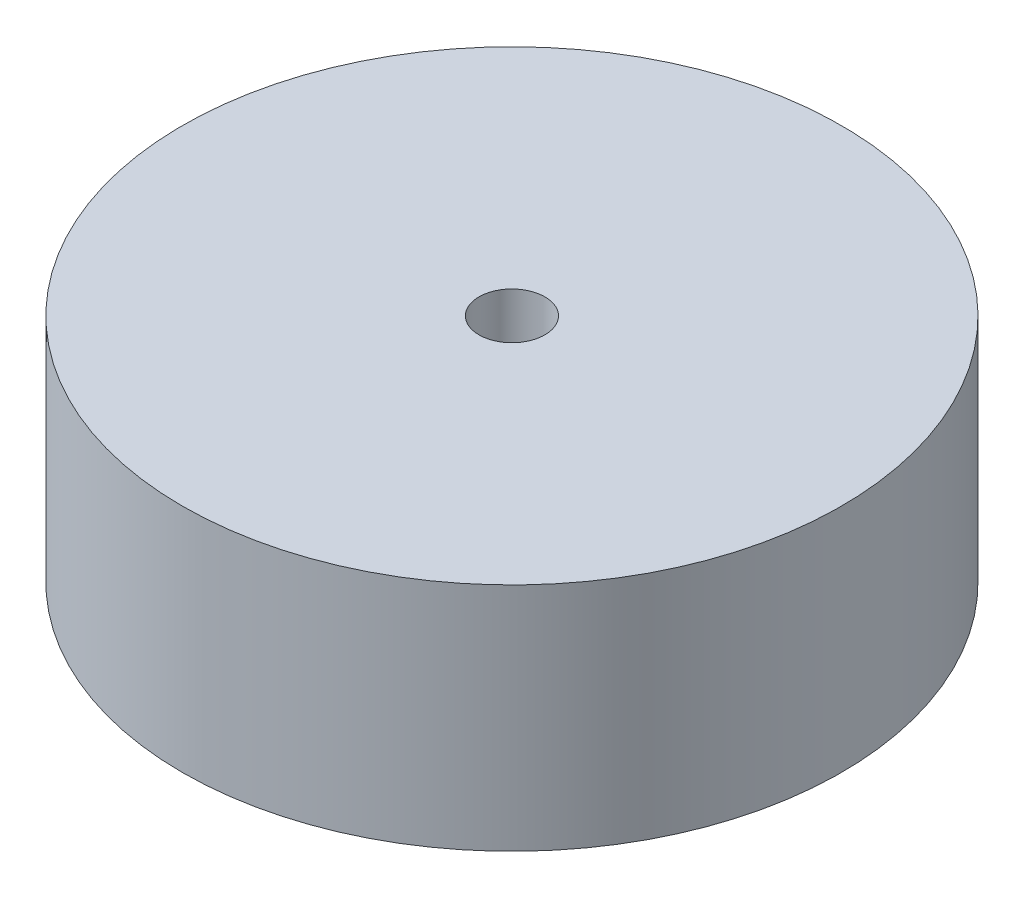
ISO-10303-21;
HEADER;
FILE_DESCRIPTION(('STEP AP214'),'2;1');
FILE_NAME('part.step','',(''),(''),'','','');
FILE_SCHEMA(('AUTOMOTIVE_DESIGN { 1 0 10303 214 1 1 1 1 }'));
ENDSEC;
DATA;
#1=APPLICATION_CONTEXT('core data for automotive mechanical design processes');
#2=APPLICATION_PROTOCOL_DEFINITION('international standard','automotive_design',2000,#1);
#3=PRODUCT_CONTEXT('',#1,'mechanical');
#4=PRODUCT('Part','Part','',(#3));
#5=PRODUCT_RELATED_PRODUCT_CATEGORY('part','',(#4));
#6=PRODUCT_DEFINITION_FORMATION('','',#4);
#7=PRODUCT_DEFINITION_CONTEXT('part definition',#1,'design');
#8=PRODUCT_DEFINITION('design','',#6,#7);
#9=PRODUCT_DEFINITION_SHAPE('','',#8);
#10=(LENGTH_UNIT() NAMED_UNIT(*) SI_UNIT(.MILLI.,.METRE.));
#11=(NAMED_UNIT(*) PLANE_ANGLE_UNIT() SI_UNIT($,.RADIAN.));
#12=(NAMED_UNIT(*) SI_UNIT($,.STERADIAN.) SOLID_ANGLE_UNIT());
#13=UNCERTAINTY_MEASURE_WITH_UNIT(LENGTH_MEASURE(1.E-05),#10,'distance_accuracy_value','');
#14=(GEOMETRIC_REPRESENTATION_CONTEXT(3) GLOBAL_UNCERTAINTY_ASSIGNED_CONTEXT((#13)) GLOBAL_UNIT_ASSIGNED_CONTEXT((#10,
#11,#12)) REPRESENTATION_CONTEXT('',''));
#15=CARTESIAN_POINT('',(0.,0.,0.));
#16=DIRECTION('',(0.,0.,1.));
#17=DIRECTION('',(1.,0.,0.));
#18=AXIS2_PLACEMENT_3D('',#15,#16,#17);
#19=CARTESIAN_POINT('',(0.,7.,0.));
#20=DIRECTION('',(0.,1.,0.));
#21=DIRECTION('',(0.,0.,1.));
#22=AXIS2_PLACEMENT_3D('',#19,#20,#21);
#23=PLANE('',#22);
#24=CARTESIAN_POINT('',(0.,7.,0.));
#25=DIRECTION('',(0.,1.,0.));
#26=DIRECTION('',(0.,0.,1.));
#27=AXIS2_PLACEMENT_3D('',#24,#25,#26);
#28=CIRCLE('',#27,10.);
#29=CARTESIAN_POINT('',(0.,7.,10.));
#30=VERTEX_POINT('',#29);
#31=EDGE_CURVE('E10',#30,#30,#28,.T.);
#32=ORIENTED_EDGE('',*,*,#31,.T.);
#33=EDGE_LOOP('',(#32));
#34=FACE_BOUND('',#33,.T.);
#35=CARTESIAN_POINT('',(0.,7.,0.));
#36=DIRECTION('',(0.,1.,0.));
#37=DIRECTION('',(0.,0.,1.));
#38=AXIS2_PLACEMENT_3D('',#35,#36,#37);
#39=CIRCLE('',#38,1.);
#40=CARTESIAN_POINT('',(0.,7.,1.));
#41=VERTEX_POINT('',#40);
#42=EDGE_CURVE('E50',#41,#41,#39,.T.);
#43=ORIENTED_EDGE('',*,*,#42,.F.);
#44=EDGE_LOOP('',(#43));
#45=FACE_BOUND('',#44,.T.);
#46=ADVANCED_FACE('F37',(#34,#45),#23,.T.);
#47=CARTESIAN_POINT('',(0.,0.,0.));
#48=DIRECTION('',(0.,1.,0.));
#49=DIRECTION('',(0.,0.,1.));
#50=AXIS2_PLACEMENT_3D('',#47,#48,#49);
#51=PLANE('',#50);
#52=CARTESIAN_POINT('',(0.,0.,0.));
#53=DIRECTION('',(0.,1.,0.));
#54=DIRECTION('',(0.,0.,1.));
#55=AXIS2_PLACEMENT_3D('',#52,#53,#54);
#56=CIRCLE('',#55,10.);
#57=CARTESIAN_POINT('',(0.,0.,10.));
#58=VERTEX_POINT('',#57);
#59=EDGE_CURVE('E41',#58,#58,#56,.T.);
#60=ORIENTED_EDGE('',*,*,#59,.F.);
#61=EDGE_LOOP('',(#60));
#62=FACE_BOUND('',#61,.T.);
#63=CARTESIAN_POINT('',(0.,0.,0.));
#64=DIRECTION('',(0.,1.,0.));
#65=DIRECTION('',(0.,0.,1.));
#66=AXIS2_PLACEMENT_3D('',#63,#64,#65);
#67=CIRCLE('',#66,1.);
#68=CARTESIAN_POINT('',(0.,0.,1.));
#69=VERTEX_POINT('',#68);
#70=EDGE_CURVE('E52',#69,#69,#67,.T.);
#71=ORIENTED_EDGE('',*,*,#70,.T.);
#72=EDGE_LOOP('',(#71));
#73=FACE_BOUND('',#72,.T.);
#74=ADVANCED_FACE('F64',(#62,#73),#51,.F.);
#75=CARTESIAN_POINT('',(0.,7.,0.));
#76=DIRECTION('',(0.,-1.,0.));
#77=DIRECTION('',(0.,0.,-1.));
#78=AXIS2_PLACEMENT_3D('',#75,#76,#77);
#79=CYLINDRICAL_SURFACE('',#78,10.);
#80=ORIENTED_EDGE('',*,*,#31,.F.);
#81=EDGE_LOOP('',(#80));
#82=FACE_BOUND('',#81,.T.);
#83=ORIENTED_EDGE('',*,*,#59,.T.);
#84=EDGE_LOOP('',(#83));
#85=FACE_BOUND('',#84,.T.);
#86=ADVANCED_FACE('F39',(#82,#85),#79,.T.);
#87=CARTESIAN_POINT('',(0.,7.,0.));
#88=DIRECTION('',(0.,-1.,0.));
#89=DIRECTION('',(0.,0.,-1.));
#90=AXIS2_PLACEMENT_3D('',#87,#88,#89);
#91=CYLINDRICAL_SURFACE('',#90,1.);
#92=ORIENTED_EDGE('',*,*,#42,.T.);
#93=EDGE_LOOP('',(#92));
#94=FACE_BOUND('',#93,.T.);
#95=ORIENTED_EDGE('',*,*,#70,.F.);
#96=EDGE_LOOP('',(#95));
#97=FACE_BOUND('',#96,.T.);
#98=ADVANCED_FACE('F60',(#94,#97),#91,.F.);
#99=CLOSED_SHELL('',(#46,#74,#86,#98));
#100=MANIFOLD_SOLID_BREP('B2',#99);
#101=ADVANCED_BREP_SHAPE_REPRESENTATION('',(#18,#100),#14);
#102=SHAPE_DEFINITION_REPRESENTATION(#9,#101);
ENDSEC;
END-ISO-10303-21;
